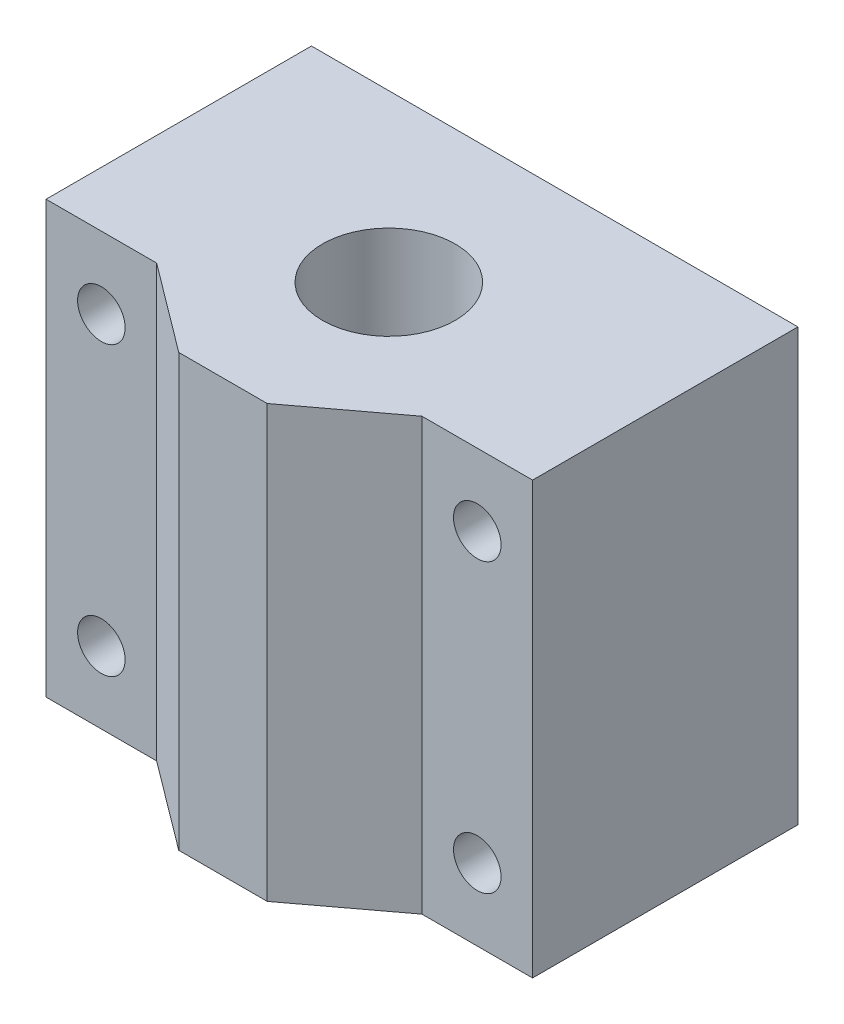
ISO-10303-21;
HEADER;
FILE_DESCRIPTION(('STEP AP214'),'2;1');
FILE_NAME('part.step','',(''),(''),'','','');
FILE_SCHEMA(('AUTOMOTIVE_DESIGN { 1 0 10303 214 1 1 1 1 }'));
ENDSEC;
DATA;
#1=APPLICATION_CONTEXT('core data for automotive mechanical design processes');
#2=APPLICATION_PROTOCOL_DEFINITION('international standard','automotive_design',2000,#1);
#3=PRODUCT_CONTEXT('',#1,'mechanical');
#4=PRODUCT('Part','Part','',(#3));
#5=PRODUCT_RELATED_PRODUCT_CATEGORY('part','',(#4));
#6=PRODUCT_DEFINITION_FORMATION('','',#4);
#7=PRODUCT_DEFINITION_CONTEXT('part definition',#1,'design');
#8=PRODUCT_DEFINITION('design','',#6,#7);
#9=PRODUCT_DEFINITION_SHAPE('','',#8);
#10=(LENGTH_UNIT() NAMED_UNIT(*) SI_UNIT(.MILLI.,.METRE.));
#11=(NAMED_UNIT(*) PLANE_ANGLE_UNIT() SI_UNIT($,.RADIAN.));
#12=(NAMED_UNIT(*) SI_UNIT($,.STERADIAN.) SOLID_ANGLE_UNIT());
#13=UNCERTAINTY_MEASURE_WITH_UNIT(LENGTH_MEASURE(1.E-05),#10,'distance_accuracy_value','');
#14=(GEOMETRIC_REPRESENTATION_CONTEXT(3) GLOBAL_UNCERTAINTY_ASSIGNED_CONTEXT((#13)) GLOBAL_UNIT_ASSIGNED_CONTEXT((#10,
#11,#12)) REPRESENTATION_CONTEXT('',''));
#15=CARTESIAN_POINT('',(0.,0.,0.));
#16=DIRECTION('',(0.,0.,1.));
#17=DIRECTION('',(1.,0.,0.));
#18=AXIS2_PLACEMENT_3D('',#15,#16,#17);
#19=CARTESIAN_POINT('',(0.,39.,0.));
#20=DIRECTION('',(0.,1.,0.));
#21=DIRECTION('',(0.,0.,1.));
#22=AXIS2_PLACEMENT_3D('',#19,#20,#21);
#23=PLANE('',#22);
#24=DIRECTION('',(0.,0.,1.));
#25=VECTOR('',#24,1.);
#26=CARTESIAN_POINT('',(-22.6000962950218,39.,-28.6496440432361));
#27=LINE('',#26,#25);
#28=CARTESIAN_POINT('',(-22.6000962950218,39.,-28.6496440432361));
#29=VERTEX_POINT('',#28);
#30=CARTESIAN_POINT('',(-22.6000962950218,39.,-4.64964404323609));
#31=VERTEX_POINT('',#30);
#32=EDGE_CURVE('E144',#29,#31,#27,.T.);
#33=ORIENTED_EDGE('',*,*,#32,.T.);
#34=DIRECTION('',(1.,0.,0.));
#35=VECTOR('',#34,1.);
#36=CARTESIAN_POINT('',(-22.6000962950218,39.,-4.64964404323609));
#37=LINE('',#36,#35);
#38=CARTESIAN_POINT('',(-12.6000962950218,39.,-4.6496440432361));
#39=VERTEX_POINT('',#38);
#40=EDGE_CURVE('E92',#31,#39,#37,.T.);
#41=ORIENTED_EDGE('',*,*,#40,.T.);
#42=DIRECTION('',(0.8,0.,0.600000000000001));
#43=VECTOR('',#42,1.);
#44=CARTESIAN_POINT('',(-12.6000962950218,39.,-4.6496440432361));
#45=LINE('',#44,#43);
#46=CARTESIAN_POINT('',(-4.60009629502176,39.,1.35035595676391));
#47=VERTEX_POINT('',#46);
#48=EDGE_CURVE('E159',#39,#47,#45,.T.);
#49=ORIENTED_EDGE('',*,*,#48,.T.);
#50=DIRECTION('',(1.,0.,0.));
#51=VECTOR('',#50,1.);
#52=CARTESIAN_POINT('',(-4.60009629502176,39.,1.35035595676391));
#53=LINE('',#52,#51);
#54=CARTESIAN_POINT('',(3.39990370497823,39.,1.35035595676391));
#55=VERTEX_POINT('',#54);
#56=EDGE_CURVE('E172',#47,#55,#53,.T.);
#57=ORIENTED_EDGE('',*,*,#56,.T.);
#58=DIRECTION('',(0.8,0.,-0.6));
#59=VECTOR('',#58,1.);
#60=CARTESIAN_POINT('',(11.3999037049782,39.,-4.64964404323609));
#61=LINE('',#60,#59);
#62=CARTESIAN_POINT('',(11.3999037049782,39.,-4.64964404323609));
#63=VERTEX_POINT('',#62);
#64=EDGE_CURVE('E111',#55,#63,#61,.T.);
#65=ORIENTED_EDGE('',*,*,#64,.T.);
#66=DIRECTION('',(1.,0.,0.));
#67=VECTOR('',#66,1.);
#68=CARTESIAN_POINT('',(21.3999037049782,39.,-4.64964404323609));
#69=LINE('',#68,#67);
#70=CARTESIAN_POINT('',(21.3999037049782,39.,-4.64964404323609));
#71=VERTEX_POINT('',#70);
#72=EDGE_CURVE('E105',#63,#71,#69,.T.);
#73=ORIENTED_EDGE('',*,*,#72,.T.);
#74=DIRECTION('',(0.,0.,-1.));
#75=VECTOR('',#74,1.);
#76=CARTESIAN_POINT('',(21.3999037049782,39.,-28.6496440432361));
#77=LINE('',#76,#75);
#78=CARTESIAN_POINT('',(21.3999037049782,39.,-28.6496440432361));
#79=VERTEX_POINT('',#78);
#80=EDGE_CURVE('E109',#71,#79,#77,.T.);
#81=ORIENTED_EDGE('',*,*,#80,.T.);
#82=DIRECTION('',(-1.,0.,0.));
#83=VECTOR('',#82,1.);
#84=CARTESIAN_POINT('',(21.3999037049782,39.,-28.6496440432361));
#85=LINE('',#84,#83);
#86=EDGE_CURVE('E49',#79,#29,#85,.T.);
#87=ORIENTED_EDGE('',*,*,#86,.T.);
#88=EDGE_LOOP('',(#33,#41,#49,#57,#65,#73,#81,#87));
#89=FACE_BOUND('',#88,.T.);
#90=CARTESIAN_POINT('',(-0.600096295021765,39.,-13.6496440432361));
#91=DIRECTION('',(0.,1.,0.));
#92=DIRECTION('',(0.,0.,1.));
#93=AXIS2_PLACEMENT_3D('',#90,#91,#92);
#94=CIRCLE('',#93,6.);
#95=CARTESIAN_POINT('',(-0.600096295021765,39.,-7.64964404323609));
#96=VERTEX_POINT('',#95);
#97=EDGE_CURVE('E133',#96,#96,#94,.T.);
#98=ORIENTED_EDGE('',*,*,#97,.F.);
#99=EDGE_LOOP('',(#98));
#100=FACE_BOUND('',#99,.T.);
#101=ADVANCED_FACE('F32',(#89,#100),#23,.T.);
#102=CARTESIAN_POINT('',(0.,0.,0.));
#103=DIRECTION('',(0.,1.,0.));
#104=DIRECTION('',(0.,0.,1.));
#105=AXIS2_PLACEMENT_3D('',#102,#103,#104);
#106=PLANE('',#105);
#107=DIRECTION('',(0.,0.,1.));
#108=VECTOR('',#107,1.);
#109=CARTESIAN_POINT('',(-22.6000962950218,0.,-28.6496440432361));
#110=LINE('',#109,#108);
#111=CARTESIAN_POINT('',(-22.6000962950218,0.,-28.6496440432361));
#112=VERTEX_POINT('',#111);
#113=CARTESIAN_POINT('',(-22.6000962950218,0.,-4.64964404323609));
#114=VERTEX_POINT('',#113);
#115=EDGE_CURVE('E129',#112,#114,#110,.T.);
#116=ORIENTED_EDGE('',*,*,#115,.F.);
#117=DIRECTION('',(-1.,0.,0.));
#118=VECTOR('',#117,1.);
#119=CARTESIAN_POINT('',(21.3999037049782,0.,-28.6496440432361));
#120=LINE('',#119,#118);
#121=CARTESIAN_POINT('',(21.3999037049782,0.,-28.6496440432361));
#122=VERTEX_POINT('',#121);
#123=EDGE_CURVE('E84',#122,#112,#120,.T.);
#124=ORIENTED_EDGE('',*,*,#123,.F.);
#125=DIRECTION('',(0.,0.,-1.));
#126=VECTOR('',#125,1.);
#127=CARTESIAN_POINT('',(21.3999037049782,0.,-28.6496440432361));
#128=LINE('',#127,#126);
#129=CARTESIAN_POINT('',(21.3999037049782,0.,-4.64964404323609));
#130=VERTEX_POINT('',#129);
#131=EDGE_CURVE('E78',#130,#122,#128,.T.);
#132=ORIENTED_EDGE('',*,*,#131,.F.);
#133=DIRECTION('',(1.,0.,0.));
#134=VECTOR('',#133,1.);
#135=CARTESIAN_POINT('',(21.3999037049782,0.,-4.64964404323609));
#136=LINE('',#135,#134);
#137=CARTESIAN_POINT('',(11.3999037049782,0.,-4.64964404323609));
#138=VERTEX_POINT('',#137);
#139=EDGE_CURVE('E119',#138,#130,#136,.T.);
#140=ORIENTED_EDGE('',*,*,#139,.F.);
#141=DIRECTION('',(0.8,0.,-0.6));
#142=VECTOR('',#141,1.);
#143=CARTESIAN_POINT('',(11.3999037049782,0.,-4.64964404323609));
#144=LINE('',#143,#142);
#145=CARTESIAN_POINT('',(3.39990370497823,0.,1.35035595676391));
#146=VERTEX_POINT('',#145);
#147=EDGE_CURVE('E139',#146,#138,#144,.T.);
#148=ORIENTED_EDGE('',*,*,#147,.F.);
#149=DIRECTION('',(1.,0.,0.));
#150=VECTOR('',#149,1.);
#151=CARTESIAN_POINT('',(-4.60009629502176,0.,1.35035595676391));
#152=LINE('',#151,#150);
#153=CARTESIAN_POINT('',(-4.60009629502176,0.,1.35035595676391));
#154=VERTEX_POINT('',#153);
#155=EDGE_CURVE('E137',#154,#146,#152,.T.);
#156=ORIENTED_EDGE('',*,*,#155,.F.);
#157=DIRECTION('',(0.8,0.,0.600000000000001));
#158=VECTOR('',#157,1.);
#159=CARTESIAN_POINT('',(-12.6000962950218,0.,-4.6496440432361));
#160=LINE('',#159,#158);
#161=CARTESIAN_POINT('',(-12.6000962950218,0.,-4.6496440432361));
#162=VERTEX_POINT('',#161);
#163=EDGE_CURVE('E135',#162,#154,#160,.T.);
#164=ORIENTED_EDGE('',*,*,#163,.F.);
#165=DIRECTION('',(1.,0.,0.));
#166=VECTOR('',#165,1.);
#167=CARTESIAN_POINT('',(-22.6000962950218,0.,-4.64964404323609));
#168=LINE('',#167,#166);
#169=EDGE_CURVE('E132',#114,#162,#168,.T.);
#170=ORIENTED_EDGE('',*,*,#169,.F.);
#171=EDGE_LOOP('',(#116,#124,#132,#140,#148,#156,#164,#170));
#172=FACE_BOUND('',#171,.T.);
#173=CARTESIAN_POINT('',(-0.600096295021765,0.,-13.6496440432361));
#174=DIRECTION('',(0.,1.,0.));
#175=DIRECTION('',(0.,0.,1.));
#176=AXIS2_PLACEMENT_3D('',#173,#174,#175);
#177=CIRCLE('',#176,6.);
#178=CARTESIAN_POINT('',(-0.600096295021765,0.,-7.64964404323609));
#179=VERTEX_POINT('',#178);
#180=EDGE_CURVE('E178',#179,#179,#177,.T.);
#181=ORIENTED_EDGE('',*,*,#180,.T.);
#182=EDGE_LOOP('',(#181));
#183=FACE_BOUND('',#182,.T.);
#184=ADVANCED_FACE('F163',(#172,#183),#106,.F.);
#185=CARTESIAN_POINT('',(-22.6000962950218,39.,-28.6496440432361));
#186=DIRECTION('',(1.,0.,0.));
#187=DIRECTION('',(0.,0.,-1.));
#188=AXIS2_PLACEMENT_3D('',#185,#186,#187);
#189=PLANE('',#188);
#190=ORIENTED_EDGE('',*,*,#115,.T.);
#191=DIRECTION('',(0.,-1.,0.));
#192=VECTOR('',#191,1.);
#193=CARTESIAN_POINT('',(-22.6000962950218,39.,-4.64964404323609));
#194=LINE('',#193,#192);
#195=EDGE_CURVE('E11',#31,#114,#194,.T.);
#196=ORIENTED_EDGE('',*,*,#195,.F.);
#197=ORIENTED_EDGE('',*,*,#32,.F.);
#198=DIRECTION('',(0.,-1.,0.));
#199=VECTOR('',#198,1.);
#200=CARTESIAN_POINT('',(-22.6000962950218,39.,-28.6496440432361));
#201=LINE('',#200,#199);
#202=EDGE_CURVE('E125',#29,#112,#201,.T.);
#203=ORIENTED_EDGE('',*,*,#202,.T.);
#204=EDGE_LOOP('',(#190,#196,#197,#203));
#205=FACE_BOUND('',#204,.T.);
#206=ADVANCED_FACE('F34',(#205),#189,.F.);
#207=CARTESIAN_POINT('',(-22.6000962950218,39.,-4.64964404323609));
#208=DIRECTION('',(0.,0.,-1.));
#209=DIRECTION('',(-1.,0.,0.));
#210=AXIS2_PLACEMENT_3D('',#207,#208,#209);
#211=PLANE('',#210);
#212=CARTESIAN_POINT('',(-17.6000962950218,6.5,-4.64964404323611));
#213=DIRECTION('',(0.,0.,1.));
#214=DIRECTION('',(1.,0.,0.));
#215=AXIS2_PLACEMENT_3D('',#212,#213,#214);
#216=CIRCLE('',#215,2.15);
#217=CARTESIAN_POINT('',(-15.4500962950218,6.5,-4.64964404323611));
#218=VERTEX_POINT('',#217);
#219=EDGE_CURVE('E190',#218,#218,#216,.T.);
#220=ORIENTED_EDGE('',*,*,#219,.F.);
#221=EDGE_LOOP('',(#220));
#222=FACE_BOUND('',#221,.T.);
#223=CARTESIAN_POINT('',(-17.6000962950218,32.5,-4.64964404323611));
#224=DIRECTION('',(0.,0.,1.));
#225=DIRECTION('',(1.,0.,0.));
#226=AXIS2_PLACEMENT_3D('',#223,#224,#225);
#227=CIRCLE('',#226,2.15);
#228=CARTESIAN_POINT('',(-15.4500962950218,32.5,-4.64964404323611));
#229=VERTEX_POINT('',#228);
#230=EDGE_CURVE('E184',#229,#229,#227,.T.);
#231=ORIENTED_EDGE('',*,*,#230,.F.);
#232=EDGE_LOOP('',(#231));
#233=FACE_BOUND('',#232,.T.);
#234=ORIENTED_EDGE('',*,*,#169,.T.);
#235=DIRECTION('',(0.,-1.,0.));
#236=VECTOR('',#235,1.);
#237=CARTESIAN_POINT('',(-12.6000962950218,39.,-4.6496440432361));
#238=LINE('',#237,#236);
#239=EDGE_CURVE('E41',#39,#162,#238,.T.);
#240=ORIENTED_EDGE('',*,*,#239,.F.);
#241=ORIENTED_EDGE('',*,*,#40,.F.);
#242=ORIENTED_EDGE('',*,*,#195,.T.);
#243=EDGE_LOOP('',(#234,#240,#241,#242));
#244=FACE_BOUND('',#243,.T.);
#245=ADVANCED_FACE('F253',(#222,#233,#244),#211,.F.);
#246=CARTESIAN_POINT('',(-12.6000962950218,39.,-4.6496440432361));
#247=DIRECTION('',(0.600000000000001,0.,-0.8));
#248=DIRECTION('',(-0.8,0.,-0.600000000000001));
#249=AXIS2_PLACEMENT_3D('',#246,#247,#248);
#250=PLANE('',#249);
#251=ORIENTED_EDGE('',*,*,#163,.T.);
#252=DIRECTION('',(0.,-1.,0.));
#253=VECTOR('',#252,1.);
#254=CARTESIAN_POINT('',(-4.60009629502176,39.,1.35035595676391));
#255=LINE('',#254,#253);
#256=EDGE_CURVE('E151',#47,#154,#255,.T.);
#257=ORIENTED_EDGE('',*,*,#256,.F.);
#258=ORIENTED_EDGE('',*,*,#48,.F.);
#259=ORIENTED_EDGE('',*,*,#239,.T.);
#260=EDGE_LOOP('',(#251,#257,#258,#259));
#261=FACE_BOUND('',#260,.T.);
#262=ADVANCED_FACE('F157',(#261),#250,.F.);
#263=CARTESIAN_POINT('',(-4.60009629502176,39.,1.35035595676391));
#264=DIRECTION('',(0.,0.,-1.));
#265=DIRECTION('',(-1.,0.,0.));
#266=AXIS2_PLACEMENT_3D('',#263,#264,#265);
#267=PLANE('',#266);
#268=ORIENTED_EDGE('',*,*,#155,.T.);
#269=DIRECTION('',(0.,-1.,0.));
#270=VECTOR('',#269,1.);
#271=CARTESIAN_POINT('',(3.39990370497823,39.,1.35035595676391));
#272=LINE('',#271,#270);
#273=EDGE_CURVE('E148',#55,#146,#272,.T.);
#274=ORIENTED_EDGE('',*,*,#273,.F.);
#275=ORIENTED_EDGE('',*,*,#56,.F.);
#276=ORIENTED_EDGE('',*,*,#256,.T.);
#277=EDGE_LOOP('',(#268,#274,#275,#276));
#278=FACE_BOUND('',#277,.T.);
#279=ADVANCED_FACE('F168',(#278),#267,.F.);
#280=CARTESIAN_POINT('',(11.3999037049782,39.,-4.64964404323609));
#281=DIRECTION('',(-0.6,0.,-0.8));
#282=DIRECTION('',(-0.8,0.,0.6));
#283=AXIS2_PLACEMENT_3D('',#280,#281,#282);
#284=PLANE('',#283);
#285=ORIENTED_EDGE('',*,*,#147,.T.);
#286=DIRECTION('',(0.,-1.,0.));
#287=VECTOR('',#286,1.);
#288=CARTESIAN_POINT('',(11.3999037049782,39.,-4.64964404323609));
#289=LINE('',#288,#287);
#290=EDGE_CURVE('E120',#63,#138,#289,.T.);
#291=ORIENTED_EDGE('',*,*,#290,.F.);
#292=ORIENTED_EDGE('',*,*,#64,.F.);
#293=ORIENTED_EDGE('',*,*,#273,.T.);
#294=EDGE_LOOP('',(#285,#291,#292,#293));
#295=FACE_BOUND('',#294,.T.);
#296=ADVANCED_FACE('F171',(#295),#284,.F.);
#297=CARTESIAN_POINT('',(21.3999037049782,39.,-4.64964404323609));
#298=DIRECTION('',(0.,0.,-1.));
#299=DIRECTION('',(-1.,0.,0.));
#300=AXIS2_PLACEMENT_3D('',#297,#298,#299);
#301=PLANE('',#300);
#302=CARTESIAN_POINT('',(16.3999037049782,32.5,-4.64964404323611));
#303=DIRECTION('',(0.,0.,1.));
#304=DIRECTION('',(-1.,0.,0.));
#305=AXIS2_PLACEMENT_3D('',#302,#303,#304);
#306=CIRCLE('',#305,2.15);
#307=CARTESIAN_POINT('',(14.2499037049782,32.5,-4.64964404323611));
#308=VERTEX_POINT('',#307);
#309=EDGE_CURVE('E202',#308,#308,#306,.T.);
#310=ORIENTED_EDGE('',*,*,#309,.F.);
#311=EDGE_LOOP('',(#310));
#312=FACE_BOUND('',#311,.T.);
#313=CARTESIAN_POINT('',(16.3999037049782,6.5,-4.64964404323611));
#314=DIRECTION('',(0.,0.,1.));
#315=DIRECTION('',(-1.,0.,0.));
#316=AXIS2_PLACEMENT_3D('',#313,#314,#315);
#317=CIRCLE('',#316,2.15);
#318=CARTESIAN_POINT('',(14.2499037049782,6.5,-4.64964404323611));
#319=VERTEX_POINT('',#318);
#320=EDGE_CURVE('E196',#319,#319,#317,.T.);
#321=ORIENTED_EDGE('',*,*,#320,.F.);
#322=EDGE_LOOP('',(#321));
#323=FACE_BOUND('',#322,.T.);
#324=ORIENTED_EDGE('',*,*,#139,.T.);
#325=DIRECTION('',(0.,-1.,0.));
#326=VECTOR('',#325,1.);
#327=CARTESIAN_POINT('',(21.3999037049782,39.,-4.64964404323609));
#328=LINE('',#327,#326);
#329=EDGE_CURVE('E116',#71,#130,#328,.T.);
#330=ORIENTED_EDGE('',*,*,#329,.F.);
#331=ORIENTED_EDGE('',*,*,#72,.F.);
#332=ORIENTED_EDGE('',*,*,#290,.T.);
#333=EDGE_LOOP('',(#324,#330,#331,#332));
#334=FACE_BOUND('',#333,.T.);
#335=ADVANCED_FACE('F117',(#312,#323,#334),#301,.F.);
#336=CARTESIAN_POINT('',(21.3999037049782,39.,-28.6496440432361));
#337=DIRECTION('',(-1.,0.,0.));
#338=DIRECTION('',(0.,0.,1.));
#339=AXIS2_PLACEMENT_3D('',#336,#337,#338);
#340=PLANE('',#339);
#341=ORIENTED_EDGE('',*,*,#131,.T.);
#342=DIRECTION('',(0.,-1.,0.));
#343=VECTOR('',#342,1.);
#344=CARTESIAN_POINT('',(21.3999037049782,39.,-28.6496440432361));
#345=LINE('',#344,#343);
#346=EDGE_CURVE('E121',#79,#122,#345,.T.);
#347=ORIENTED_EDGE('',*,*,#346,.F.);
#348=ORIENTED_EDGE('',*,*,#80,.F.);
#349=ORIENTED_EDGE('',*,*,#329,.T.);
#350=EDGE_LOOP('',(#341,#347,#348,#349));
#351=FACE_BOUND('',#350,.T.);
#352=ADVANCED_FACE('F123',(#351),#340,.F.);
#353=CARTESIAN_POINT('',(21.3999037049782,39.,-28.6496440432361));
#354=DIRECTION('',(0.,0.,1.));
#355=DIRECTION('',(1.,0.,0.));
#356=AXIS2_PLACEMENT_3D('',#353,#354,#355);
#357=PLANE('',#356);
#358=CARTESIAN_POINT('',(16.3999037049782,32.5,-28.6496440432361));
#359=DIRECTION('',(0.,0.,1.));
#360=DIRECTION('',(-1.,0.,0.));
#361=AXIS2_PLACEMENT_3D('',#358,#359,#360);
#362=CIRCLE('',#361,2.15);
#363=CARTESIAN_POINT('',(14.2499037049782,32.5,-28.6496440432361));
#364=VERTEX_POINT('',#363);
#365=EDGE_CURVE('E199',#364,#364,#362,.T.);
#366=ORIENTED_EDGE('',*,*,#365,.T.);
#367=EDGE_LOOP('',(#366));
#368=FACE_BOUND('',#367,.T.);
#369=CARTESIAN_POINT('',(16.3999037049782,6.5,-28.6496440432361));
#370=DIRECTION('',(0.,0.,1.));
#371=DIRECTION('',(-1.,0.,0.));
#372=AXIS2_PLACEMENT_3D('',#369,#370,#371);
#373=CIRCLE('',#372,2.15);
#374=CARTESIAN_POINT('',(14.2499037049782,6.5,-28.6496440432361));
#375=VERTEX_POINT('',#374);
#376=EDGE_CURVE('E193',#375,#375,#373,.T.);
#377=ORIENTED_EDGE('',*,*,#376,.T.);
#378=EDGE_LOOP('',(#377));
#379=FACE_BOUND('',#378,.T.);
#380=CARTESIAN_POINT('',(-17.6000962950218,6.5,-28.6496440432361));
#381=DIRECTION('',(0.,0.,1.));
#382=DIRECTION('',(1.,0.,0.));
#383=AXIS2_PLACEMENT_3D('',#380,#381,#382);
#384=CIRCLE('',#383,2.15);
#385=CARTESIAN_POINT('',(-15.4500962950218,6.5,-28.6496440432361));
#386=VERTEX_POINT('',#385);
#387=EDGE_CURVE('E187',#386,#386,#384,.T.);
#388=ORIENTED_EDGE('',*,*,#387,.T.);
#389=EDGE_LOOP('',(#388));
#390=FACE_BOUND('',#389,.T.);
#391=CARTESIAN_POINT('',(-17.6000962950218,32.5,-28.6496440432361));
#392=DIRECTION('',(0.,0.,1.));
#393=DIRECTION('',(1.,0.,0.));
#394=AXIS2_PLACEMENT_3D('',#391,#392,#393);
#395=CIRCLE('',#394,2.15);
#396=CARTESIAN_POINT('',(-15.4500962950218,32.5,-28.6496440432361));
#397=VERTEX_POINT('',#396);
#398=EDGE_CURVE('E181',#397,#397,#395,.T.);
#399=ORIENTED_EDGE('',*,*,#398,.T.);
#400=EDGE_LOOP('',(#399));
#401=FACE_BOUND('',#400,.T.);
#402=ORIENTED_EDGE('',*,*,#123,.T.);
#403=ORIENTED_EDGE('',*,*,#202,.F.);
#404=ORIENTED_EDGE('',*,*,#86,.F.);
#405=ORIENTED_EDGE('',*,*,#346,.T.);
#406=EDGE_LOOP('',(#402,#403,#404,#405));
#407=FACE_BOUND('',#406,.T.);
#408=ADVANCED_FACE('F208',(#368,#379,#390,#401,#407),#357,.F.);
#409=CARTESIAN_POINT('',(-0.600096295021765,39.,-13.6496440432361));
#410=DIRECTION('',(0.,-1.,0.));
#411=DIRECTION('',(0.,0.,-1.));
#412=AXIS2_PLACEMENT_3D('',#409,#410,#411);
#413=CYLINDRICAL_SURFACE('',#412,6.);
#414=ORIENTED_EDGE('',*,*,#97,.T.);
#415=EDGE_LOOP('',(#414));
#416=FACE_BOUND('',#415,.T.);
#417=ORIENTED_EDGE('',*,*,#180,.F.);
#418=EDGE_LOOP('',(#417));
#419=FACE_BOUND('',#418,.T.);
#420=ADVANCED_FACE('F241',(#416,#419),#413,.F.);
#421=CARTESIAN_POINT('',(-17.6000962950218,32.5,-28.6496440432361));
#422=DIRECTION('',(0.,0.,1.));
#423=DIRECTION('',(1.,0.,0.));
#424=AXIS2_PLACEMENT_3D('',#421,#422,#423);
#425=CYLINDRICAL_SURFACE('',#424,2.15);
#426=ORIENTED_EDGE('',*,*,#398,.F.);
#427=EDGE_LOOP('',(#426));
#428=FACE_BOUND('',#427,.T.);
#429=ORIENTED_EDGE('',*,*,#230,.T.);
#430=EDGE_LOOP('',(#429));
#431=FACE_BOUND('',#430,.T.);
#432=ADVANCED_FACE('F230',(#428,#431),#425,.F.);
#433=CARTESIAN_POINT('',(-17.6000962950218,6.5,-28.6496440432361));
#434=DIRECTION('',(0.,0.,1.));
#435=DIRECTION('',(1.,0.,0.));
#436=AXIS2_PLACEMENT_3D('',#433,#434,#435);
#437=CYLINDRICAL_SURFACE('',#436,2.15);
#438=ORIENTED_EDGE('',*,*,#387,.F.);
#439=EDGE_LOOP('',(#438));
#440=FACE_BOUND('',#439,.T.);
#441=ORIENTED_EDGE('',*,*,#219,.T.);
#442=EDGE_LOOP('',(#441));
#443=FACE_BOUND('',#442,.T.);
#444=ADVANCED_FACE('F224',(#440,#443),#437,.F.);
#445=CARTESIAN_POINT('',(16.3999037049782,6.5,-28.6496440432361));
#446=DIRECTION('',(0.,0.,1.));
#447=DIRECTION('',(1.,0.,0.));
#448=AXIS2_PLACEMENT_3D('',#445,#446,#447);
#449=CYLINDRICAL_SURFACE('',#448,2.15);
#450=ORIENTED_EDGE('',*,*,#376,.F.);
#451=EDGE_LOOP('',(#450));
#452=FACE_BOUND('',#451,.T.);
#453=ORIENTED_EDGE('',*,*,#320,.T.);
#454=EDGE_LOOP('',(#453));
#455=FACE_BOUND('',#454,.T.);
#456=ADVANCED_FACE('F214',(#452,#455),#449,.F.);
#457=CARTESIAN_POINT('',(16.3999037049782,32.5,-28.6496440432361));
#458=DIRECTION('',(0.,0.,1.));
#459=DIRECTION('',(1.,0.,0.));
#460=AXIS2_PLACEMENT_3D('',#457,#458,#459);
#461=CYLINDRICAL_SURFACE('',#460,2.15);
#462=ORIENTED_EDGE('',*,*,#365,.F.);
#463=EDGE_LOOP('',(#462));
#464=FACE_BOUND('',#463,.T.);
#465=ORIENTED_EDGE('',*,*,#309,.T.);
#466=EDGE_LOOP('',(#465));
#467=FACE_BOUND('',#466,.T.);
#468=ADVANCED_FACE('F211',(#464,#467),#461,.F.);
#469=CLOSED_SHELL('',(#101,#184,#206,#245,#262,#279,#296,#335,#352,#408,#420,#432,#444,#456,#468));
#470=MANIFOLD_SOLID_BREP('B2',#469);
#471=ADVANCED_BREP_SHAPE_REPRESENTATION('',(#18,#470),#14);
#472=SHAPE_DEFINITION_REPRESENTATION(#9,#471);
ENDSEC;
END-ISO-10303-21;
